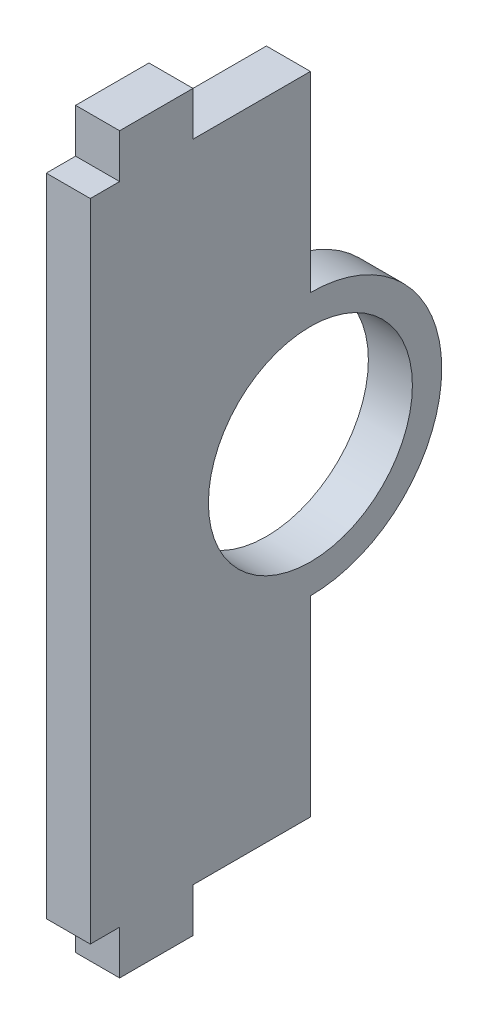
ISO-10303-21;
HEADER;
FILE_DESCRIPTION(('STEP AP214'),'2;1');
FILE_NAME('part.step','',(''),(''),'','','');
FILE_SCHEMA(('AUTOMOTIVE_DESIGN { 1 0 10303 214 1 1 1 1 }'));
ENDSEC;
DATA;
#1=APPLICATION_CONTEXT('core data for automotive mechanical design processes');
#2=APPLICATION_PROTOCOL_DEFINITION('international standard','automotive_design',2000,#1);
#3=PRODUCT_CONTEXT('',#1,'mechanical');
#4=PRODUCT('Part','Part','',(#3));
#5=PRODUCT_RELATED_PRODUCT_CATEGORY('part','',(#4));
#6=PRODUCT_DEFINITION_FORMATION('','',#4);
#7=PRODUCT_DEFINITION_CONTEXT('part definition',#1,'design');
#8=PRODUCT_DEFINITION('design','',#6,#7);
#9=PRODUCT_DEFINITION_SHAPE('','',#8);
#10=(LENGTH_UNIT() NAMED_UNIT(*) SI_UNIT(.MILLI.,.METRE.));
#11=(NAMED_UNIT(*) PLANE_ANGLE_UNIT() SI_UNIT($,.RADIAN.));
#12=(NAMED_UNIT(*) SI_UNIT($,.STERADIAN.) SOLID_ANGLE_UNIT());
#13=UNCERTAINTY_MEASURE_WITH_UNIT(LENGTH_MEASURE(1.E-05),#10,'distance_accuracy_value','');
#14=(GEOMETRIC_REPRESENTATION_CONTEXT(3) GLOBAL_UNCERTAINTY_ASSIGNED_CONTEXT((#13)) GLOBAL_UNIT_ASSIGNED_CONTEXT((#10,
#11,#12)) REPRESENTATION_CONTEXT('',''));
#15=CARTESIAN_POINT('',(0.,0.,0.));
#16=DIRECTION('',(0.,0.,1.));
#17=DIRECTION('',(1.,0.,0.));
#18=AXIS2_PLACEMENT_3D('',#15,#16,#17);
#19=CARTESIAN_POINT('',(3.,-22.,15.));
#20=DIRECTION('',(0.,0.,1.));
#21=DIRECTION('',(1.,0.,0.));
#22=AXIS2_PLACEMENT_3D('',#19,#20,#21);
#23=PLANE('',#22);
#24=DIRECTION('',(0.,1.,0.));
#25=VECTOR('',#24,1.);
#26=CARTESIAN_POINT('',(0.,-22.,15.));
#27=LINE('',#26,#25);
#28=CARTESIAN_POINT('',(0.,-22.,15.));
#29=VERTEX_POINT('',#28);
#30=CARTESIAN_POINT('',(0.,22.,15.));
#31=VERTEX_POINT('',#30);
#32=EDGE_CURVE('E161',#29,#31,#27,.T.);
#33=ORIENTED_EDGE('',*,*,#32,.F.);
#34=DIRECTION('',(-1.,0.,0.));
#35=VECTOR('',#34,1.);
#36=CARTESIAN_POINT('',(3.,-22.,15.));
#37=LINE('',#36,#35);
#38=CARTESIAN_POINT('',(3.,-22.,15.));
#39=VERTEX_POINT('',#38);
#40=EDGE_CURVE('E32',#39,#29,#37,.T.);
#41=ORIENTED_EDGE('',*,*,#40,.F.);
#42=DIRECTION('',(0.,1.,0.));
#43=VECTOR('',#42,1.);
#44=CARTESIAN_POINT('',(3.,-22.,15.));
#45=LINE('',#44,#43);
#46=CARTESIAN_POINT('',(3.,22.,15.));
#47=VERTEX_POINT('',#46);
#48=EDGE_CURVE('E150',#39,#47,#45,.T.);
#49=ORIENTED_EDGE('',*,*,#48,.T.);
#50=DIRECTION('',(-1.,0.,0.));
#51=VECTOR('',#50,1.);
#52=CARTESIAN_POINT('',(3.,22.,15.));
#53=LINE('',#52,#51);
#54=EDGE_CURVE('E10',#47,#31,#53,.T.);
#55=ORIENTED_EDGE('',*,*,#54,.T.);
#56=EDGE_LOOP('',(#33,#41,#49,#55));
#57=FACE_BOUND('',#56,.T.);
#58=ADVANCED_FACE('F16',(#57),#23,.T.);
#59=CARTESIAN_POINT('',(3.,22.,15.));
#60=DIRECTION('',(0.,1.,0.));
#61=DIRECTION('',(0.,0.,1.));
#62=AXIS2_PLACEMENT_3D('',#59,#60,#61);
#63=PLANE('',#62);
#64=DIRECTION('',(0.,0.,-1.));
#65=VECTOR('',#64,1.);
#66=CARTESIAN_POINT('',(0.,22.,15.));
#67=LINE('',#66,#65);
#68=CARTESIAN_POINT('',(0.,22.,13.));
#69=VERTEX_POINT('',#68);
#70=EDGE_CURVE('E156',#31,#69,#67,.T.);
#71=ORIENTED_EDGE('',*,*,#70,.F.);
#72=ORIENTED_EDGE('',*,*,#54,.F.);
#73=DIRECTION('',(0.,0.,-1.));
#74=VECTOR('',#73,1.);
#75=CARTESIAN_POINT('',(3.,22.,15.));
#76=LINE('',#75,#74);
#77=CARTESIAN_POINT('',(3.,22.,13.));
#78=VERTEX_POINT('',#77);
#79=EDGE_CURVE('E152',#47,#78,#76,.T.);
#80=ORIENTED_EDGE('',*,*,#79,.T.);
#81=DIRECTION('',(-1.,0.,0.));
#82=VECTOR('',#81,1.);
#83=CARTESIAN_POINT('',(3.,22.,13.));
#84=LINE('',#83,#82);
#85=EDGE_CURVE('E24',#78,#69,#84,.T.);
#86=ORIENTED_EDGE('',*,*,#85,.T.);
#87=EDGE_LOOP('',(#71,#72,#80,#86));
#88=FACE_BOUND('',#87,.T.);
#89=ADVANCED_FACE('F230',(#88),#63,.T.);
#90=CARTESIAN_POINT('',(3.,22.,13.));
#91=DIRECTION('',(0.,0.,1.));
#92=DIRECTION('',(1.,0.,0.));
#93=AXIS2_PLACEMENT_3D('',#90,#91,#92);
#94=PLANE('',#93);
#95=DIRECTION('',(0.,1.,0.));
#96=VECTOR('',#95,1.);
#97=CARTESIAN_POINT('',(0.,22.,13.));
#98=LINE('',#97,#96);
#99=CARTESIAN_POINT('',(0.,25.,13.));
#100=VERTEX_POINT('',#99);
#101=EDGE_CURVE('E160',#69,#100,#98,.T.);
#102=ORIENTED_EDGE('',*,*,#101,.F.);
#103=ORIENTED_EDGE('',*,*,#85,.F.);
#104=DIRECTION('',(0.,1.,0.));
#105=VECTOR('',#104,1.);
#106=CARTESIAN_POINT('',(3.,22.,13.));
#107=LINE('',#106,#105);
#108=CARTESIAN_POINT('',(3.,25.,13.));
#109=VERTEX_POINT('',#108);
#110=EDGE_CURVE('E240',#78,#109,#107,.T.);
#111=ORIENTED_EDGE('',*,*,#110,.T.);
#112=DIRECTION('',(-1.,0.,0.));
#113=VECTOR('',#112,1.);
#114=CARTESIAN_POINT('',(3.,25.,13.));
#115=LINE('',#114,#113);
#116=EDGE_CURVE('E228',#109,#100,#115,.T.);
#117=ORIENTED_EDGE('',*,*,#116,.T.);
#118=EDGE_LOOP('',(#102,#103,#111,#117));
#119=FACE_BOUND('',#118,.T.);
#120=ADVANCED_FACE('F234',(#119),#94,.T.);
#121=CARTESIAN_POINT('',(3.,25.,13.));
#122=DIRECTION('',(0.,1.,0.));
#123=DIRECTION('',(0.,0.,1.));
#124=AXIS2_PLACEMENT_3D('',#121,#122,#123);
#125=PLANE('',#124);
#126=DIRECTION('',(0.,0.,-1.));
#127=VECTOR('',#126,1.);
#128=CARTESIAN_POINT('',(0.,25.,13.));
#129=LINE('',#128,#127);
#130=CARTESIAN_POINT('',(0.,25.,7.99999999999999));
#131=VERTEX_POINT('',#130);
#132=EDGE_CURVE('E165',#100,#131,#129,.T.);
#133=ORIENTED_EDGE('',*,*,#132,.F.);
#134=ORIENTED_EDGE('',*,*,#116,.F.);
#135=DIRECTION('',(0.,0.,-1.));
#136=VECTOR('',#135,1.);
#137=CARTESIAN_POINT('',(3.,25.,13.));
#138=LINE('',#137,#136);
#139=CARTESIAN_POINT('',(3.,25.,7.99999999999999));
#140=VERTEX_POINT('',#139);
#141=EDGE_CURVE('E242',#109,#140,#138,.T.);
#142=ORIENTED_EDGE('',*,*,#141,.T.);
#143=DIRECTION('',(-1.,0.,0.));
#144=VECTOR('',#143,1.);
#145=CARTESIAN_POINT('',(3.,25.,7.99999999999999));
#146=LINE('',#145,#144);
#147=EDGE_CURVE('E226',#140,#131,#146,.T.);
#148=ORIENTED_EDGE('',*,*,#147,.T.);
#149=EDGE_LOOP('',(#133,#134,#142,#148));
#150=FACE_BOUND('',#149,.T.);
#151=ADVANCED_FACE('F292',(#150),#125,.T.);
#152=CARTESIAN_POINT('',(3.,25.,7.99999999999999));
#153=DIRECTION('',(0.,0.,-1.));
#154=DIRECTION('',(-1.,0.,0.));
#155=AXIS2_PLACEMENT_3D('',#152,#153,#154);
#156=PLANE('',#155);
#157=DIRECTION('',(0.,-1.,0.));
#158=VECTOR('',#157,1.);
#159=CARTESIAN_POINT('',(0.,25.,7.99999999999999));
#160=LINE('',#159,#158);
#161=CARTESIAN_POINT('',(0.,22.,7.99999999999999));
#162=VERTEX_POINT('',#161);
#163=EDGE_CURVE('E169',#131,#162,#160,.T.);
#164=ORIENTED_EDGE('',*,*,#163,.F.);
#165=ORIENTED_EDGE('',*,*,#147,.F.);
#166=DIRECTION('',(0.,-1.,0.));
#167=VECTOR('',#166,1.);
#168=CARTESIAN_POINT('',(3.,25.,7.99999999999999));
#169=LINE('',#168,#167);
#170=CARTESIAN_POINT('',(3.,22.,7.99999999999999));
#171=VERTEX_POINT('',#170);
#172=EDGE_CURVE('E247',#140,#171,#169,.T.);
#173=ORIENTED_EDGE('',*,*,#172,.T.);
#174=DIRECTION('',(-1.,0.,0.));
#175=VECTOR('',#174,1.);
#176=CARTESIAN_POINT('',(3.,22.,7.99999999999999));
#177=LINE('',#176,#175);
#178=EDGE_CURVE('E224',#171,#162,#177,.T.);
#179=ORIENTED_EDGE('',*,*,#178,.T.);
#180=EDGE_LOOP('',(#164,#165,#173,#179));
#181=FACE_BOUND('',#180,.T.);
#182=ADVANCED_FACE('F290',(#181),#156,.T.);
#183=CARTESIAN_POINT('',(3.,22.,7.99999999999999));
#184=DIRECTION('',(0.,1.,0.));
#185=DIRECTION('',(0.,0.,1.));
#186=AXIS2_PLACEMENT_3D('',#183,#184,#185);
#187=PLANE('',#186);
#188=DIRECTION('',(0.,0.,-1.));
#189=VECTOR('',#188,1.);
#190=CARTESIAN_POINT('',(0.,22.,7.99999999999999));
#191=LINE('',#190,#189);
#192=CARTESIAN_POINT('',(0.,22.,0.));
#193=VERTEX_POINT('',#192);
#194=EDGE_CURVE('E173',#162,#193,#191,.T.);
#195=ORIENTED_EDGE('',*,*,#194,.F.);
#196=ORIENTED_EDGE('',*,*,#178,.F.);
#197=DIRECTION('',(0.,0.,-1.));
#198=VECTOR('',#197,1.);
#199=CARTESIAN_POINT('',(3.,22.,7.99999999999999));
#200=LINE('',#199,#198);
#201=CARTESIAN_POINT('',(3.,22.,0.));
#202=VERTEX_POINT('',#201);
#203=EDGE_CURVE('E250',#171,#202,#200,.T.);
#204=ORIENTED_EDGE('',*,*,#203,.T.);
#205=DIRECTION('',(-1.,0.,0.));
#206=VECTOR('',#205,1.);
#207=CARTESIAN_POINT('',(3.,22.,0.));
#208=LINE('',#207,#206);
#209=EDGE_CURVE('E222',#202,#193,#208,.T.);
#210=ORIENTED_EDGE('',*,*,#209,.T.);
#211=EDGE_LOOP('',(#195,#196,#204,#210));
#212=FACE_BOUND('',#211,.T.);
#213=ADVANCED_FACE('F287',(#212),#187,.T.);
#214=CARTESIAN_POINT('',(3.,22.,0.));
#215=DIRECTION('',(0.,0.,-1.));
#216=DIRECTION('',(0.,1.,0.));
#217=AXIS2_PLACEMENT_3D('',#214,#215,#216);
#218=PLANE('',#217);
#219=DIRECTION('',(0.,-1.,0.));
#220=VECTOR('',#219,1.);
#221=CARTESIAN_POINT('',(0.,22.,0.));
#222=LINE('',#221,#220);
#223=CARTESIAN_POINT('',(0.,8.95,0.));
#224=VERTEX_POINT('',#223);
#225=EDGE_CURVE('E177',#193,#224,#222,.T.);
#226=ORIENTED_EDGE('',*,*,#225,.F.);
#227=ORIENTED_EDGE('',*,*,#209,.F.);
#228=DIRECTION('',(0.,-1.,0.));
#229=VECTOR('',#228,1.);
#230=CARTESIAN_POINT('',(3.,22.,0.));
#231=LINE('',#230,#229);
#232=CARTESIAN_POINT('',(3.,8.95,0.));
#233=VERTEX_POINT('',#232);
#234=EDGE_CURVE('E253',#202,#233,#231,.T.);
#235=ORIENTED_EDGE('',*,*,#234,.T.);
#236=DIRECTION('',(-1.,0.,0.));
#237=VECTOR('',#236,1.);
#238=CARTESIAN_POINT('',(3.,8.95,0.));
#239=LINE('',#238,#237);
#240=EDGE_CURVE('E220',#233,#224,#239,.T.);
#241=ORIENTED_EDGE('',*,*,#240,.T.);
#242=EDGE_LOOP('',(#226,#227,#235,#241));
#243=FACE_BOUND('',#242,.T.);
#244=ADVANCED_FACE('F284',(#243),#218,.T.);
#245=CARTESIAN_POINT('',(3.,0.,0.));
#246=DIRECTION('',(-1.,0.,0.));
#247=DIRECTION('',(0.,0.,1.));
#248=AXIS2_PLACEMENT_3D('',#245,#246,#247);
#249=CYLINDRICAL_SURFACE('',#248,8.95);
#250=CARTESIAN_POINT('',(0.,0.,0.));
#251=DIRECTION('',(-1.,0.,0.));
#252=DIRECTION('',(0.,1.,0.));
#253=AXIS2_PLACEMENT_3D('',#250,#251,#252);
#254=CIRCLE('',#253,8.95);
#255=CARTESIAN_POINT('',(0.,-8.95,0.));
#256=VERTEX_POINT('',#255);
#257=EDGE_CURVE('E181',#224,#256,#254,.T.);
#258=ORIENTED_EDGE('',*,*,#257,.F.);
#259=ORIENTED_EDGE('',*,*,#240,.F.);
#260=CARTESIAN_POINT('',(3.,0.,0.));
#261=DIRECTION('',(-1.,0.,0.));
#262=DIRECTION('',(0.,1.,0.));
#263=AXIS2_PLACEMENT_3D('',#260,#261,#262);
#264=CIRCLE('',#263,8.95);
#265=CARTESIAN_POINT('',(3.,-8.95,0.));
#266=VERTEX_POINT('',#265);
#267=EDGE_CURVE('E256',#233,#266,#264,.T.);
#268=ORIENTED_EDGE('',*,*,#267,.T.);
#269=DIRECTION('',(-1.,0.,0.));
#270=VECTOR('',#269,1.);
#271=CARTESIAN_POINT('',(3.,-8.95,0.));
#272=LINE('',#271,#270);
#273=EDGE_CURVE('E218',#266,#256,#272,.T.);
#274=ORIENTED_EDGE('',*,*,#273,.T.);
#275=EDGE_LOOP('',(#258,#259,#268,#274));
#276=FACE_BOUND('',#275,.T.);
#277=ADVANCED_FACE('F278',(#276),#249,.T.);
#278=CARTESIAN_POINT('',(3.,-8.95,0.));
#279=DIRECTION('',(0.,0.,-1.));
#280=DIRECTION('',(0.,1.,0.));
#281=AXIS2_PLACEMENT_3D('',#278,#279,#280);
#282=PLANE('',#281);
#283=DIRECTION('',(0.,-1.,0.));
#284=VECTOR('',#283,1.);
#285=CARTESIAN_POINT('',(0.,-8.95,0.));
#286=LINE('',#285,#284);
#287=CARTESIAN_POINT('',(0.,-22.,0.));
#288=VERTEX_POINT('',#287);
#289=EDGE_CURVE('E185',#256,#288,#286,.T.);
#290=ORIENTED_EDGE('',*,*,#289,.F.);
#291=ORIENTED_EDGE('',*,*,#273,.F.);
#292=DIRECTION('',(0.,-1.,0.));
#293=VECTOR('',#292,1.);
#294=CARTESIAN_POINT('',(3.,-8.95,0.));
#295=LINE('',#294,#293);
#296=CARTESIAN_POINT('',(3.,-22.,0.));
#297=VERTEX_POINT('',#296);
#298=EDGE_CURVE('E259',#266,#297,#295,.T.);
#299=ORIENTED_EDGE('',*,*,#298,.T.);
#300=DIRECTION('',(-1.,0.,0.));
#301=VECTOR('',#300,1.);
#302=CARTESIAN_POINT('',(3.,-22.,0.));
#303=LINE('',#302,#301);
#304=EDGE_CURVE('E216',#297,#288,#303,.T.);
#305=ORIENTED_EDGE('',*,*,#304,.T.);
#306=EDGE_LOOP('',(#290,#291,#299,#305));
#307=FACE_BOUND('',#306,.T.);
#308=ADVANCED_FACE('F275',(#307),#282,.T.);
#309=CARTESIAN_POINT('',(3.,-22.,0.));
#310=DIRECTION('',(0.,-1.,0.));
#311=DIRECTION('',(0.,0.,-1.));
#312=AXIS2_PLACEMENT_3D('',#309,#310,#311);
#313=PLANE('',#312);
#314=DIRECTION('',(0.,0.,1.));
#315=VECTOR('',#314,1.);
#316=CARTESIAN_POINT('',(0.,-22.,0.));
#317=LINE('',#316,#315);
#318=CARTESIAN_POINT('',(0.,-22.,7.99999999999999));
#319=VERTEX_POINT('',#318);
#320=EDGE_CURVE('E189',#288,#319,#317,.T.);
#321=ORIENTED_EDGE('',*,*,#320,.F.);
#322=ORIENTED_EDGE('',*,*,#304,.F.);
#323=DIRECTION('',(0.,0.,1.));
#324=VECTOR('',#323,1.);
#325=CARTESIAN_POINT('',(3.,-22.,0.));
#326=LINE('',#325,#324);
#327=CARTESIAN_POINT('',(3.,-22.,7.99999999999999));
#328=VERTEX_POINT('',#327);
#329=EDGE_CURVE('E262',#297,#328,#326,.T.);
#330=ORIENTED_EDGE('',*,*,#329,.T.);
#331=DIRECTION('',(-1.,0.,0.));
#332=VECTOR('',#331,1.);
#333=CARTESIAN_POINT('',(3.,-22.,7.99999999999999));
#334=LINE('',#333,#332);
#335=EDGE_CURVE('E214',#328,#319,#334,.T.);
#336=ORIENTED_EDGE('',*,*,#335,.T.);
#337=EDGE_LOOP('',(#321,#322,#330,#336));
#338=FACE_BOUND('',#337,.T.);
#339=ADVANCED_FACE('F272',(#338),#313,.T.);
#340=CARTESIAN_POINT('',(3.,-22.,7.99999999999999));
#341=DIRECTION('',(0.,0.,-1.));
#342=DIRECTION('',(-1.,0.,0.));
#343=AXIS2_PLACEMENT_3D('',#340,#341,#342);
#344=PLANE('',#343);
#345=DIRECTION('',(0.,-1.,0.));
#346=VECTOR('',#345,1.);
#347=CARTESIAN_POINT('',(0.,-22.,7.99999999999999));
#348=LINE('',#347,#346);
#349=CARTESIAN_POINT('',(0.,-25.,7.99999999999999));
#350=VERTEX_POINT('',#349);
#351=EDGE_CURVE('E193',#319,#350,#348,.T.);
#352=ORIENTED_EDGE('',*,*,#351,.F.);
#353=ORIENTED_EDGE('',*,*,#335,.F.);
#354=DIRECTION('',(0.,-1.,0.));
#355=VECTOR('',#354,1.);
#356=CARTESIAN_POINT('',(3.,-22.,7.99999999999999));
#357=LINE('',#356,#355);
#358=CARTESIAN_POINT('',(3.,-25.,7.99999999999999));
#359=VERTEX_POINT('',#358);
#360=EDGE_CURVE('E139',#328,#359,#357,.T.);
#361=ORIENTED_EDGE('',*,*,#360,.T.);
#362=DIRECTION('',(-1.,0.,0.));
#363=VECTOR('',#362,1.);
#364=CARTESIAN_POINT('',(3.,-25.,7.99999999999999));
#365=LINE('',#364,#363);
#366=EDGE_CURVE('E131',#359,#350,#365,.T.);
#367=ORIENTED_EDGE('',*,*,#366,.T.);
#368=EDGE_LOOP('',(#352,#353,#361,#367));
#369=FACE_BOUND('',#368,.T.);
#370=ADVANCED_FACE('F266',(#369),#344,.T.);
#371=CARTESIAN_POINT('',(3.,-25.,7.99999999999999));
#372=DIRECTION('',(0.,-1.,0.));
#373=DIRECTION('',(0.,0.,-1.));
#374=AXIS2_PLACEMENT_3D('',#371,#372,#373);
#375=PLANE('',#374);
#376=DIRECTION('',(0.,0.,1.));
#377=VECTOR('',#376,1.);
#378=CARTESIAN_POINT('',(0.,-25.,7.99999999999999));
#379=LINE('',#378,#377);
#380=CARTESIAN_POINT('',(0.,-25.,13.));
#381=VERTEX_POINT('',#380);
#382=EDGE_CURVE('E197',#350,#381,#379,.T.);
#383=ORIENTED_EDGE('',*,*,#382,.F.);
#384=ORIENTED_EDGE('',*,*,#366,.F.);
#385=DIRECTION('',(0.,0.,1.));
#386=VECTOR('',#385,1.);
#387=CARTESIAN_POINT('',(3.,-25.,7.99999999999999));
#388=LINE('',#387,#386);
#389=CARTESIAN_POINT('',(3.,-25.,13.));
#390=VERTEX_POINT('',#389);
#391=EDGE_CURVE('E134',#359,#390,#388,.T.);
#392=ORIENTED_EDGE('',*,*,#391,.T.);
#393=DIRECTION('',(-1.,0.,0.));
#394=VECTOR('',#393,1.);
#395=CARTESIAN_POINT('',(3.,-25.,13.));
#396=LINE('',#395,#394);
#397=EDGE_CURVE('E120',#390,#381,#396,.T.);
#398=ORIENTED_EDGE('',*,*,#397,.T.);
#399=EDGE_LOOP('',(#383,#384,#392,#398));
#400=FACE_BOUND('',#399,.T.);
#401=ADVANCED_FACE('F135',(#400),#375,.T.);
#402=CARTESIAN_POINT('',(3.,-25.,13.));
#403=DIRECTION('',(0.,0.,1.));
#404=DIRECTION('',(1.,0.,0.));
#405=AXIS2_PLACEMENT_3D('',#402,#403,#404);
#406=PLANE('',#405);
#407=DIRECTION('',(0.,1.,0.));
#408=VECTOR('',#407,1.);
#409=CARTESIAN_POINT('',(0.,-25.,13.));
#410=LINE('',#409,#408);
#411=CARTESIAN_POINT('',(0.,-22.,13.));
#412=VERTEX_POINT('',#411);
#413=EDGE_CURVE('E127',#381,#412,#410,.T.);
#414=ORIENTED_EDGE('',*,*,#413,.F.);
#415=ORIENTED_EDGE('',*,*,#397,.F.);
#416=DIRECTION('',(0.,1.,0.));
#417=VECTOR('',#416,1.);
#418=CARTESIAN_POINT('',(3.,-25.,13.));
#419=LINE('',#418,#417);
#420=CARTESIAN_POINT('',(3.,-22.,13.));
#421=VERTEX_POINT('',#420);
#422=EDGE_CURVE('E124',#390,#421,#419,.T.);
#423=ORIENTED_EDGE('',*,*,#422,.T.);
#424=DIRECTION('',(-1.,0.,0.));
#425=VECTOR('',#424,1.);
#426=CARTESIAN_POINT('',(3.,-22.,13.));
#427=LINE('',#426,#425);
#428=EDGE_CURVE('E78',#421,#412,#427,.T.);
#429=ORIENTED_EDGE('',*,*,#428,.T.);
#430=EDGE_LOOP('',(#414,#415,#423,#429));
#431=FACE_BOUND('',#430,.T.);
#432=ADVANCED_FACE('F122',(#431),#406,.T.);
#433=CARTESIAN_POINT('',(3.,-22.,13.));
#434=DIRECTION('',(0.,-1.,0.));
#435=DIRECTION('',(0.,0.,-1.));
#436=AXIS2_PLACEMENT_3D('',#433,#434,#435);
#437=PLANE('',#436);
#438=DIRECTION('',(0.,0.,1.));
#439=VECTOR('',#438,1.);
#440=CARTESIAN_POINT('',(0.,-22.,13.));
#441=LINE('',#440,#439);
#442=EDGE_CURVE('E202',#412,#29,#441,.T.);
#443=ORIENTED_EDGE('',*,*,#442,.F.);
#444=ORIENTED_EDGE('',*,*,#428,.F.);
#445=DIRECTION('',(0.,0.,1.));
#446=VECTOR('',#445,1.);
#447=CARTESIAN_POINT('',(3.,-22.,13.));
#448=LINE('',#447,#446);
#449=EDGE_CURVE('E144',#421,#39,#448,.T.);
#450=ORIENTED_EDGE('',*,*,#449,.T.);
#451=ORIENTED_EDGE('',*,*,#40,.T.);
#452=EDGE_LOOP('',(#443,#444,#450,#451));
#453=FACE_BOUND('',#452,.T.);
#454=ADVANCED_FACE('F402',(#453),#437,.T.);
#455=CARTESIAN_POINT('',(3.,0.,0.));
#456=DIRECTION('',(-1.,0.,0.));
#457=DIRECTION('',(0.,0.,1.));
#458=AXIS2_PLACEMENT_3D('',#455,#456,#457);
#459=CYLINDRICAL_SURFACE('',#458,6.95);
#460=CARTESIAN_POINT('',(3.,0.,0.));
#461=DIRECTION('',(1.,0.,0.));
#462=DIRECTION('',(0.,1.,0.));
#463=AXIS2_PLACEMENT_3D('',#460,#461,#462);
#464=CIRCLE('',#463,6.95);
#465=CARTESIAN_POINT('',(3.,6.95,0.));
#466=VERTEX_POINT('',#465);
#467=EDGE_CURVE('E146',#466,#466,#464,.T.);
#468=ORIENTED_EDGE('',*,*,#467,.T.);
#469=EDGE_LOOP('',(#468));
#470=FACE_BOUND('',#469,.T.);
#471=CARTESIAN_POINT('',(0.,0.,0.));
#472=DIRECTION('',(1.,0.,0.));
#473=DIRECTION('',(0.,1.,0.));
#474=AXIS2_PLACEMENT_3D('',#471,#472,#473);
#475=CIRCLE('',#474,6.95);
#476=CARTESIAN_POINT('',(0.,6.95,0.));
#477=VERTEX_POINT('',#476);
#478=EDGE_CURVE('E153',#477,#477,#475,.T.);
#479=ORIENTED_EDGE('',*,*,#478,.F.);
#480=EDGE_LOOP('',(#479));
#481=FACE_BOUND('',#480,.T.);
#482=ADVANCED_FACE('F412',(#470,#481),#459,.F.);
#483=CARTESIAN_POINT('',(3.,0.,0.));
#484=DIRECTION('',(-1.,0.,0.));
#485=DIRECTION('',(0.,-1.,0.));
#486=AXIS2_PLACEMENT_3D('',#483,#484,#485);
#487=PLANE('',#486);
#488=ORIENTED_EDGE('',*,*,#48,.F.);
#489=ORIENTED_EDGE('',*,*,#449,.F.);
#490=ORIENTED_EDGE('',*,*,#422,.F.);
#491=ORIENTED_EDGE('',*,*,#391,.F.);
#492=ORIENTED_EDGE('',*,*,#360,.F.);
#493=ORIENTED_EDGE('',*,*,#329,.F.);
#494=ORIENTED_EDGE('',*,*,#298,.F.);
#495=ORIENTED_EDGE('',*,*,#267,.F.);
#496=ORIENTED_EDGE('',*,*,#234,.F.);
#497=ORIENTED_EDGE('',*,*,#203,.F.);
#498=ORIENTED_EDGE('',*,*,#172,.F.);
#499=ORIENTED_EDGE('',*,*,#141,.F.);
#500=ORIENTED_EDGE('',*,*,#110,.F.);
#501=ORIENTED_EDGE('',*,*,#79,.F.);
#502=EDGE_LOOP('',(#488,#489,#490,#491,#492,#493,#494,#495,#496,#497,#498,#499,#500,#501));
#503=FACE_BOUND('',#502,.T.);
#504=ORIENTED_EDGE('',*,*,#467,.F.);
#505=EDGE_LOOP('',(#504));
#506=FACE_BOUND('',#505,.T.);
#507=ADVANCED_FACE('F142',(#503,#506),#487,.F.);
#508=CARTESIAN_POINT('',(0.,0.,0.));
#509=DIRECTION('',(-1.,0.,0.));
#510=DIRECTION('',(0.,-1.,0.));
#511=AXIS2_PLACEMENT_3D('',#508,#509,#510);
#512=PLANE('',#511);
#513=ORIENTED_EDGE('',*,*,#32,.T.);
#514=ORIENTED_EDGE('',*,*,#70,.T.);
#515=ORIENTED_EDGE('',*,*,#101,.T.);
#516=ORIENTED_EDGE('',*,*,#132,.T.);
#517=ORIENTED_EDGE('',*,*,#163,.T.);
#518=ORIENTED_EDGE('',*,*,#194,.T.);
#519=ORIENTED_EDGE('',*,*,#225,.T.);
#520=ORIENTED_EDGE('',*,*,#257,.T.);
#521=ORIENTED_EDGE('',*,*,#289,.T.);
#522=ORIENTED_EDGE('',*,*,#320,.T.);
#523=ORIENTED_EDGE('',*,*,#351,.T.);
#524=ORIENTED_EDGE('',*,*,#382,.T.);
#525=ORIENTED_EDGE('',*,*,#413,.T.);
#526=ORIENTED_EDGE('',*,*,#442,.T.);
#527=EDGE_LOOP('',(#513,#514,#515,#516,#517,#518,#519,#520,#521,#522,#523,#524,#525,#526));
#528=FACE_BOUND('',#527,.T.);
#529=ORIENTED_EDGE('',*,*,#478,.T.);
#530=EDGE_LOOP('',(#529));
#531=FACE_BOUND('',#530,.T.);
#532=ADVANCED_FACE('F237',(#528,#531),#512,.T.);
#533=CLOSED_SHELL('',(#58,#89,#120,#151,#182,#213,#244,#277,#308,#339,#370,#401,#432,#454,#482,
#507,#532));
#534=MANIFOLD_SOLID_BREP('B1',#533);
#535=ADVANCED_BREP_SHAPE_REPRESENTATION('',(#18,#534),#14);
#536=SHAPE_DEFINITION_REPRESENTATION(#9,#535);
ENDSEC;
END-ISO-10303-21;
